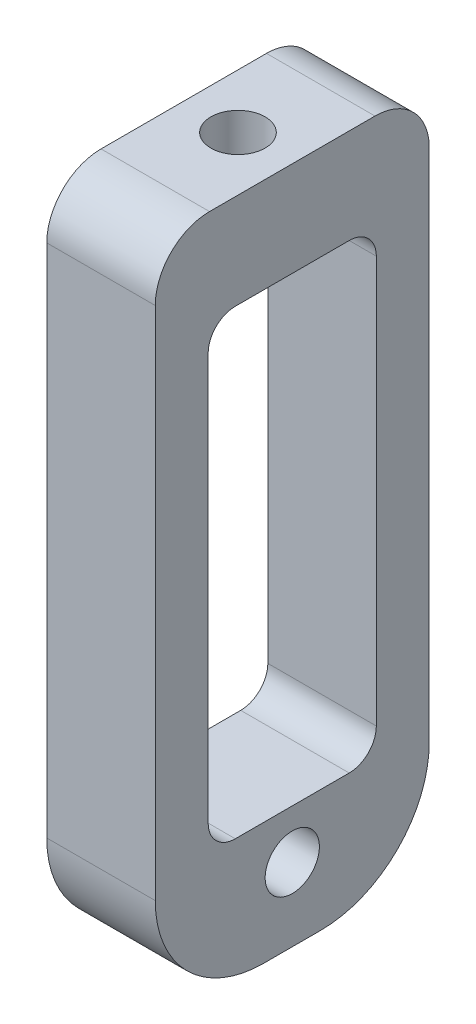
ISO-10303-21;
HEADER;
FILE_DESCRIPTION(('STEP AP214'),'2;1');
FILE_NAME('part.step','',(''),(''),'','','');
FILE_SCHEMA(('AUTOMOTIVE_DESIGN { 1 0 10303 214 1 1 1 1 }'));
ENDSEC;
DATA;
#1=APPLICATION_CONTEXT('core data for automotive mechanical design processes');
#2=APPLICATION_PROTOCOL_DEFINITION('international standard','automotive_design',2000,#1);
#3=PRODUCT_CONTEXT('',#1,'mechanical');
#4=PRODUCT('Part','Part','',(#3));
#5=PRODUCT_RELATED_PRODUCT_CATEGORY('part','',(#4));
#6=PRODUCT_DEFINITION_FORMATION('','',#4);
#7=PRODUCT_DEFINITION_CONTEXT('part definition',#1,'design');
#8=PRODUCT_DEFINITION('design','',#6,#7);
#9=PRODUCT_DEFINITION_SHAPE('','',#8);
#10=(LENGTH_UNIT() NAMED_UNIT(*) SI_UNIT(.MILLI.,.METRE.));
#11=(NAMED_UNIT(*) PLANE_ANGLE_UNIT() SI_UNIT($,.RADIAN.));
#12=(NAMED_UNIT(*) SI_UNIT($,.STERADIAN.) SOLID_ANGLE_UNIT());
#13=UNCERTAINTY_MEASURE_WITH_UNIT(LENGTH_MEASURE(1.E-05),#10,'distance_accuracy_value','');
#14=(GEOMETRIC_REPRESENTATION_CONTEXT(3) GLOBAL_UNCERTAINTY_ASSIGNED_CONTEXT((#13)) GLOBAL_UNIT_ASSIGNED_CONTEXT((#10,
#11,#12)) REPRESENTATION_CONTEXT('',''));
#15=CARTESIAN_POINT('',(0.,0.,0.));
#16=DIRECTION('',(0.,0.,1.));
#17=DIRECTION('',(1.,0.,0.));
#18=AXIS2_PLACEMENT_3D('',#15,#16,#17);
#19=CARTESIAN_POINT('',(2.,25.,5.05));
#20=DIRECTION('',(-1.,0.,0.));
#21=DIRECTION('',(0.,0.,1.));
#22=AXIS2_PLACEMENT_3D('',#19,#20,#21);
#23=PLANE('',#22);
#24=DIRECTION('',(0.,0.,-1.));
#25=VECTOR('',#24,1.);
#26=CARTESIAN_POINT('',(2.,4.5,3.1));
#27=LINE('',#26,#25);
#28=CARTESIAN_POINT('',(2.,4.5,2.1));
#29=VERTEX_POINT('',#28);
#30=CARTESIAN_POINT('',(2.,4.5,-2.1));
#31=VERTEX_POINT('',#30);
#32=EDGE_CURVE('E268',#29,#31,#27,.T.);
#33=ORIENTED_EDGE('',*,*,#32,.F.);
#34=CARTESIAN_POINT('',(2.,5.5,2.1));
#35=DIRECTION('',(-1.,0.,0.));
#36=DIRECTION('',(0.,0.,1.));
#37=AXIS2_PLACEMENT_3D('',#34,#35,#36);
#38=CIRCLE('',#37,1.);
#39=CARTESIAN_POINT('',(2.,5.5,3.1));
#40=VERTEX_POINT('',#39);
#41=EDGE_CURVE('E230',#29,#40,#38,.T.);
#42=ORIENTED_EDGE('',*,*,#41,.T.);
#43=DIRECTION('',(0.,-1.,0.));
#44=VECTOR('',#43,1.);
#45=CARTESIAN_POINT('',(2.,4.5,3.1));
#46=LINE('',#45,#44);
#47=CARTESIAN_POINT('',(2.,20.5,3.1));
#48=VERTEX_POINT('',#47);
#49=EDGE_CURVE('E259',#48,#40,#46,.T.);
#50=ORIENTED_EDGE('',*,*,#49,.F.);
#51=CARTESIAN_POINT('',(2.,20.5,2.1));
#52=DIRECTION('',(-1.,0.,0.));
#53=DIRECTION('',(0.,0.,1.));
#54=AXIS2_PLACEMENT_3D('',#51,#52,#53);
#55=CIRCLE('',#54,1.);
#56=CARTESIAN_POINT('',(2.,21.5,2.1));
#57=VERTEX_POINT('',#56);
#58=EDGE_CURVE('E11',#48,#57,#55,.T.);
#59=ORIENTED_EDGE('',*,*,#58,.T.);
#60=DIRECTION('',(0.,0.,1.));
#61=VECTOR('',#60,1.);
#62=CARTESIAN_POINT('',(2.,21.5,3.1));
#63=LINE('',#62,#61);
#64=CARTESIAN_POINT('',(2.,21.5,-2.1));
#65=VERTEX_POINT('',#64);
#66=EDGE_CURVE('E257',#65,#57,#63,.T.);
#67=ORIENTED_EDGE('',*,*,#66,.F.);
#68=CARTESIAN_POINT('',(2.,20.5,-2.1));
#69=DIRECTION('',(-1.,0.,0.));
#70=DIRECTION('',(0.,0.,1.));
#71=AXIS2_PLACEMENT_3D('',#68,#69,#70);
#72=CIRCLE('',#71,1.);
#73=CARTESIAN_POINT('',(2.,20.5,-3.1));
#74=VERTEX_POINT('',#73);
#75=EDGE_CURVE('E237',#65,#74,#72,.T.);
#76=ORIENTED_EDGE('',*,*,#75,.T.);
#77=DIRECTION('',(0.,1.,0.));
#78=VECTOR('',#77,1.);
#79=CARTESIAN_POINT('',(2.,4.5,-3.1));
#80=LINE('',#79,#78);
#81=CARTESIAN_POINT('',(2.,5.5,-3.1));
#82=VERTEX_POINT('',#81);
#83=EDGE_CURVE('E444',#82,#74,#80,.T.);
#84=ORIENTED_EDGE('',*,*,#83,.F.);
#85=CARTESIAN_POINT('',(2.,5.5,-2.1));
#86=DIRECTION('',(-1.,0.,0.));
#87=DIRECTION('',(0.,0.,1.));
#88=AXIS2_PLACEMENT_3D('',#85,#86,#87);
#89=CIRCLE('',#88,1.);
#90=EDGE_CURVE('E234',#82,#31,#89,.T.);
#91=ORIENTED_EDGE('',*,*,#90,.T.);
#92=EDGE_LOOP('',(#33,#42,#50,#59,#67,#76,#84,#91));
#93=FACE_BOUND('',#92,.T.);
#94=CARTESIAN_POINT('',(2.,2.7,0.));
#95=DIRECTION('',(-1.,0.,0.));
#96=DIRECTION('',(0.,0.,1.));
#97=AXIS2_PLACEMENT_3D('',#94,#95,#96);
#98=CIRCLE('',#97,1.);
#99=CARTESIAN_POINT('',(2.,2.7,1.));
#100=VERTEX_POINT('',#99);
#101=EDGE_CURVE('E266',#100,#100,#98,.F.);
#102=ORIENTED_EDGE('',*,*,#101,.F.);
#103=EDGE_LOOP('',(#102));
#104=FACE_BOUND('',#103,.T.);
#105=DIRECTION('',(0.,-1.,0.));
#106=VECTOR('',#105,1.);
#107=CARTESIAN_POINT('',(2.,25.,-5.05));
#108=LINE('',#107,#106);
#109=CARTESIAN_POINT('',(2.,23.,-5.05));
#110=VERTEX_POINT('',#109);
#111=CARTESIAN_POINT('',(2.,4.,-5.05));
#112=VERTEX_POINT('',#111);
#113=EDGE_CURVE('E175',#110,#112,#108,.T.);
#114=ORIENTED_EDGE('',*,*,#113,.F.);
#115=CARTESIAN_POINT('',(2.,23.,-3.05));
#116=DIRECTION('',(-1.,0.,0.));
#117=DIRECTION('',(0.,0.,1.));
#118=AXIS2_PLACEMENT_3D('',#115,#116,#117);
#119=CIRCLE('',#118,2.);
#120=CARTESIAN_POINT('',(2.,25.,-3.05));
#121=VERTEX_POINT('',#120);
#122=EDGE_CURVE('E205',#110,#121,#119,.F.);
#123=ORIENTED_EDGE('',*,*,#122,.T.);
#124=DIRECTION('',(0.,0.,-1.));
#125=VECTOR('',#124,1.);
#126=CARTESIAN_POINT('',(2.,25.,5.05));
#127=LINE('',#126,#125);
#128=CARTESIAN_POINT('',(2.,25.,3.05));
#129=VERTEX_POINT('',#128);
#130=EDGE_CURVE('E277',#129,#121,#127,.T.);
#131=ORIENTED_EDGE('',*,*,#130,.F.);
#132=CARTESIAN_POINT('',(2.,23.,3.05));
#133=DIRECTION('',(-1.,0.,0.));
#134=DIRECTION('',(0.,0.,1.));
#135=AXIS2_PLACEMENT_3D('',#132,#133,#134);
#136=CIRCLE('',#135,2.);
#137=CARTESIAN_POINT('',(2.,23.,5.05));
#138=VERTEX_POINT('',#137);
#139=EDGE_CURVE('E155',#129,#138,#136,.F.);
#140=ORIENTED_EDGE('',*,*,#139,.T.);
#141=DIRECTION('',(0.,-1.,0.));
#142=VECTOR('',#141,1.);
#143=CARTESIAN_POINT('',(2.,25.,5.05));
#144=LINE('',#143,#142);
#145=CARTESIAN_POINT('',(2.,4.,5.05));
#146=VERTEX_POINT('',#145);
#147=EDGE_CURVE('E148',#138,#146,#144,.T.);
#148=ORIENTED_EDGE('',*,*,#147,.T.);
#149=CARTESIAN_POINT('',(2.,4.,1.05));
#150=DIRECTION('',(-1.,0.,0.));
#151=DIRECTION('',(0.,0.,1.));
#152=AXIS2_PLACEMENT_3D('',#149,#150,#151);
#153=CIRCLE('',#152,4.);
#154=CARTESIAN_POINT('',(2.,0.,1.05));
#155=VERTEX_POINT('',#154);
#156=EDGE_CURVE('E152',#146,#155,#153,.F.);
#157=ORIENTED_EDGE('',*,*,#156,.T.);
#158=DIRECTION('',(0.,0.,-1.));
#159=VECTOR('',#158,1.);
#160=CARTESIAN_POINT('',(2.,0.,5.05));
#161=LINE('',#160,#159);
#162=CARTESIAN_POINT('',(2.,0.,-1.05));
#163=VERTEX_POINT('',#162);
#164=EDGE_CURVE('E276',#155,#163,#161,.T.);
#165=ORIENTED_EDGE('',*,*,#164,.T.);
#166=CARTESIAN_POINT('',(2.,4.,-1.05));
#167=DIRECTION('',(-1.,0.,0.));
#168=DIRECTION('',(0.,0.,1.));
#169=AXIS2_PLACEMENT_3D('',#166,#167,#168);
#170=CIRCLE('',#169,4.);
#171=EDGE_CURVE('E170',#163,#112,#170,.F.);
#172=ORIENTED_EDGE('',*,*,#171,.T.);
#173=EDGE_LOOP('',(#114,#123,#131,#140,#148,#157,#165,#172));
#174=FACE_BOUND('',#173,.T.);
#175=ADVANCED_FACE('F36',(#93,#104,#174),#23,.F.);
#176=CARTESIAN_POINT('',(-2.,25.,-5.05));
#177=DIRECTION('',(0.,0.,1.));
#178=DIRECTION('',(1.,0.,0.));
#179=AXIS2_PLACEMENT_3D('',#176,#177,#178);
#180=PLANE('',#179);
#181=DIRECTION('',(0.,-1.,0.));
#182=VECTOR('',#181,1.);
#183=CARTESIAN_POINT('',(-2.,25.,-5.05));
#184=LINE('',#183,#182);
#185=CARTESIAN_POINT('',(-2.,23.,-5.05));
#186=VERTEX_POINT('',#185);
#187=CARTESIAN_POINT('',(-2.,4.,-5.05));
#188=VERTEX_POINT('',#187);
#189=EDGE_CURVE('E179',#186,#188,#184,.T.);
#190=ORIENTED_EDGE('',*,*,#189,.F.);
#191=DIRECTION('',(-1.,0.,0.));
#192=VECTOR('',#191,1.);
#193=CARTESIAN_POINT('',(-2.,23.,-5.05));
#194=LINE('',#193,#192);
#195=EDGE_CURVE('E202',#186,#110,#194,.F.);
#196=ORIENTED_EDGE('',*,*,#195,.T.);
#197=ORIENTED_EDGE('',*,*,#113,.T.);
#198=DIRECTION('',(-1.,0.,0.));
#199=VECTOR('',#198,1.);
#200=CARTESIAN_POINT('',(-2.,4.,-5.05));
#201=LINE('',#200,#199);
#202=EDGE_CURVE('E189',#112,#188,#201,.T.);
#203=ORIENTED_EDGE('',*,*,#202,.T.);
#204=EDGE_LOOP('',(#190,#196,#197,#203));
#205=FACE_BOUND('',#204,.T.);
#206=ADVANCED_FACE('F298',(#205),#180,.F.);
#207=CARTESIAN_POINT('',(-2.,25.,5.05));
#208=DIRECTION('',(1.,0.,0.));
#209=DIRECTION('',(0.,0.,-1.));
#210=AXIS2_PLACEMENT_3D('',#207,#208,#209);
#211=PLANE('',#210);
#212=DIRECTION('',(0.,0.,-1.));
#213=VECTOR('',#212,1.);
#214=CARTESIAN_POINT('',(-2.,21.5,3.1));
#215=LINE('',#214,#213);
#216=CARTESIAN_POINT('',(-2.,21.5,2.1));
#217=VERTEX_POINT('',#216);
#218=CARTESIAN_POINT('',(-2.,21.5,-2.1));
#219=VERTEX_POINT('',#218);
#220=EDGE_CURVE('E243',#217,#219,#215,.T.);
#221=ORIENTED_EDGE('',*,*,#220,.F.);
#222=CARTESIAN_POINT('',(-2.,20.5,2.1));
#223=DIRECTION('',(1.,0.,0.));
#224=DIRECTION('',(0.,0.,-1.));
#225=AXIS2_PLACEMENT_3D('',#222,#223,#224);
#226=CIRCLE('',#225,1.);
#227=CARTESIAN_POINT('',(-2.,20.5,3.1));
#228=VERTEX_POINT('',#227);
#229=EDGE_CURVE('E44',#217,#228,#226,.T.);
#230=ORIENTED_EDGE('',*,*,#229,.T.);
#231=DIRECTION('',(0.,1.,0.));
#232=VECTOR('',#231,1.);
#233=CARTESIAN_POINT('',(-2.,4.5,3.1));
#234=LINE('',#233,#232);
#235=CARTESIAN_POINT('',(-2.,5.5,3.1));
#236=VERTEX_POINT('',#235);
#237=EDGE_CURVE('E242',#236,#228,#234,.T.);
#238=ORIENTED_EDGE('',*,*,#237,.F.);
#239=CARTESIAN_POINT('',(-2.,5.5,2.1));
#240=DIRECTION('',(1.,0.,0.));
#241=DIRECTION('',(0.,0.,-1.));
#242=AXIS2_PLACEMENT_3D('',#239,#240,#241);
#243=CIRCLE('',#242,1.);
#244=CARTESIAN_POINT('',(-2.,4.5,2.1));
#245=VERTEX_POINT('',#244);
#246=EDGE_CURVE('E228',#236,#245,#243,.T.);
#247=ORIENTED_EDGE('',*,*,#246,.T.);
#248=DIRECTION('',(0.,0.,1.));
#249=VECTOR('',#248,1.);
#250=CARTESIAN_POINT('',(-2.,4.5,3.1));
#251=LINE('',#250,#249);
#252=CARTESIAN_POINT('',(-2.,4.5,-2.1));
#253=VERTEX_POINT('',#252);
#254=EDGE_CURVE('E271',#253,#245,#251,.T.);
#255=ORIENTED_EDGE('',*,*,#254,.F.);
#256=CARTESIAN_POINT('',(-2.,5.5,-2.1));
#257=DIRECTION('',(1.,0.,0.));
#258=DIRECTION('',(0.,0.,-1.));
#259=AXIS2_PLACEMENT_3D('',#256,#257,#258);
#260=CIRCLE('',#259,1.);
#261=CARTESIAN_POINT('',(-2.,5.5,-3.1));
#262=VERTEX_POINT('',#261);
#263=EDGE_CURVE('E232',#253,#262,#260,.T.);
#264=ORIENTED_EDGE('',*,*,#263,.T.);
#265=DIRECTION('',(0.,-1.,0.));
#266=VECTOR('',#265,1.);
#267=CARTESIAN_POINT('',(-2.,4.5,-3.1));
#268=LINE('',#267,#266);
#269=CARTESIAN_POINT('',(-2.,20.5,-3.1));
#270=VERTEX_POINT('',#269);
#271=EDGE_CURVE('E452',#270,#262,#268,.T.);
#272=ORIENTED_EDGE('',*,*,#271,.F.);
#273=CARTESIAN_POINT('',(-2.,20.5,-2.1));
#274=DIRECTION('',(1.,0.,0.));
#275=DIRECTION('',(0.,0.,-1.));
#276=AXIS2_PLACEMENT_3D('',#273,#274,#275);
#277=CIRCLE('',#276,1.);
#278=EDGE_CURVE('E51',#270,#219,#277,.T.);
#279=ORIENTED_EDGE('',*,*,#278,.T.);
#280=EDGE_LOOP('',(#221,#230,#238,#247,#255,#264,#272,#279));
#281=FACE_BOUND('',#280,.T.);
#282=CARTESIAN_POINT('',(-2.,2.7,0.));
#283=DIRECTION('',(-1.,0.,0.));
#284=DIRECTION('',(0.,0.,1.));
#285=AXIS2_PLACEMENT_3D('',#282,#283,#284);
#286=CIRCLE('',#285,1.);
#287=CARTESIAN_POINT('',(-2.,2.7,1.));
#288=VERTEX_POINT('',#287);
#289=EDGE_CURVE('E263',#288,#288,#286,.T.);
#290=ORIENTED_EDGE('',*,*,#289,.F.);
#291=EDGE_LOOP('',(#290));
#292=FACE_BOUND('',#291,.T.);
#293=DIRECTION('',(0.,0.,1.));
#294=VECTOR('',#293,1.);
#295=CARTESIAN_POINT('',(-2.,25.,5.05));
#296=LINE('',#295,#294);
#297=CARTESIAN_POINT('',(-2.,25.,-3.05));
#298=VERTEX_POINT('',#297);
#299=CARTESIAN_POINT('',(-2.,25.,3.05));
#300=VERTEX_POINT('',#299);
#301=EDGE_CURVE('E160',#298,#300,#296,.T.);
#302=ORIENTED_EDGE('',*,*,#301,.F.);
#303=CARTESIAN_POINT('',(-2.,23.,-3.05));
#304=DIRECTION('',(1.,0.,0.));
#305=DIRECTION('',(0.,0.,-1.));
#306=AXIS2_PLACEMENT_3D('',#303,#304,#305);
#307=CIRCLE('',#306,2.);
#308=EDGE_CURVE('E200',#298,#186,#307,.F.);
#309=ORIENTED_EDGE('',*,*,#308,.T.);
#310=ORIENTED_EDGE('',*,*,#189,.T.);
#311=CARTESIAN_POINT('',(-2.,4.,-1.05));
#312=DIRECTION('',(1.,0.,0.));
#313=DIRECTION('',(0.,0.,-1.));
#314=AXIS2_PLACEMENT_3D('',#311,#312,#313);
#315=CIRCLE('',#314,4.);
#316=CARTESIAN_POINT('',(-2.,0.,-1.05));
#317=VERTEX_POINT('',#316);
#318=EDGE_CURVE('E185',#188,#317,#315,.F.);
#319=ORIENTED_EDGE('',*,*,#318,.T.);
#320=DIRECTION('',(0.,0.,1.));
#321=VECTOR('',#320,1.);
#322=CARTESIAN_POINT('',(-2.,0.,5.05));
#323=LINE('',#322,#321);
#324=CARTESIAN_POINT('',(-2.,0.,1.05));
#325=VERTEX_POINT('',#324);
#326=EDGE_CURVE('E280',#317,#325,#323,.T.);
#327=ORIENTED_EDGE('',*,*,#326,.T.);
#328=CARTESIAN_POINT('',(-2.,4.,1.05));
#329=DIRECTION('',(1.,0.,0.));
#330=DIRECTION('',(0.,0.,-1.));
#331=AXIS2_PLACEMENT_3D('',#328,#329,#330);
#332=CIRCLE('',#331,4.);
#333=CARTESIAN_POINT('',(-2.,4.,5.05));
#334=VERTEX_POINT('',#333);
#335=EDGE_CURVE('E187',#325,#334,#332,.F.);
#336=ORIENTED_EDGE('',*,*,#335,.T.);
#337=DIRECTION('',(0.,-1.,0.));
#338=VECTOR('',#337,1.);
#339=CARTESIAN_POINT('',(-2.,25.,5.05));
#340=LINE('',#339,#338);
#341=CARTESIAN_POINT('',(-2.,23.,5.05));
#342=VERTEX_POINT('',#341);
#343=EDGE_CURVE('E159',#342,#334,#340,.T.);
#344=ORIENTED_EDGE('',*,*,#343,.F.);
#345=CARTESIAN_POINT('',(-2.,23.,3.05));
#346=DIRECTION('',(1.,0.,0.));
#347=DIRECTION('',(0.,0.,-1.));
#348=AXIS2_PLACEMENT_3D('',#345,#346,#347);
#349=CIRCLE('',#348,2.);
#350=EDGE_CURVE('E198',#342,#300,#349,.F.);
#351=ORIENTED_EDGE('',*,*,#350,.T.);
#352=EDGE_LOOP('',(#302,#309,#310,#319,#327,#336,#344,#351));
#353=FACE_BOUND('',#352,.T.);
#354=ADVANCED_FACE('F240',(#281,#292,#353),#211,.F.);
#355=CARTESIAN_POINT('',(-2.,25.,5.05));
#356=DIRECTION('',(0.,0.,-1.));
#357=DIRECTION('',(-1.,0.,0.));
#358=AXIS2_PLACEMENT_3D('',#355,#356,#357);
#359=PLANE('',#358);
#360=ORIENTED_EDGE('',*,*,#147,.F.);
#361=DIRECTION('',(1.,0.,0.));
#362=VECTOR('',#361,1.);
#363=CARTESIAN_POINT('',(-2.,23.,5.05));
#364=LINE('',#363,#362);
#365=EDGE_CURVE('E207',#138,#342,#364,.F.);
#366=ORIENTED_EDGE('',*,*,#365,.T.);
#367=ORIENTED_EDGE('',*,*,#343,.T.);
#368=DIRECTION('',(1.,0.,0.));
#369=VECTOR('',#368,1.);
#370=CARTESIAN_POINT('',(2.,4.,5.05));
#371=LINE('',#370,#369);
#372=EDGE_CURVE('E167',#334,#146,#371,.T.);
#373=ORIENTED_EDGE('',*,*,#372,.T.);
#374=EDGE_LOOP('',(#360,#366,#367,#373));
#375=FACE_BOUND('',#374,.T.);
#376=ADVANCED_FACE('F172',(#375),#359,.F.);
#377=CARTESIAN_POINT('',(0.,25.,0.));
#378=DIRECTION('',(0.,-1.,0.));
#379=DIRECTION('',(0.,0.,-1.));
#380=AXIS2_PLACEMENT_3D('',#377,#378,#379);
#381=PLANE('',#380);
#382=CARTESIAN_POINT('',(0.,25.,0.));
#383=DIRECTION('',(0.,1.,0.));
#384=DIRECTION('',(0.,0.,1.));
#385=AXIS2_PLACEMENT_3D('',#382,#383,#384);
#386=CIRCLE('',#385,1.);
#387=CARTESIAN_POINT('',(0.,25.,1.));
#388=VERTEX_POINT('',#387);
#389=EDGE_CURVE('E460',#388,#388,#386,.T.);
#390=ORIENTED_EDGE('',*,*,#389,.F.);
#391=EDGE_LOOP('',(#390));
#392=FACE_BOUND('',#391,.T.);
#393=ORIENTED_EDGE('',*,*,#130,.T.);
#394=DIRECTION('',(-1.,0.,0.));
#395=VECTOR('',#394,1.);
#396=CARTESIAN_POINT('',(0.,25.,-3.05));
#397=LINE('',#396,#395);
#398=EDGE_CURVE('E195',#121,#298,#397,.T.);
#399=ORIENTED_EDGE('',*,*,#398,.T.);
#400=ORIENTED_EDGE('',*,*,#301,.T.);
#401=DIRECTION('',(1.,0.,0.));
#402=VECTOR('',#401,1.);
#403=CARTESIAN_POINT('',(0.,25.,3.05));
#404=LINE('',#403,#402);
#405=EDGE_CURVE('E192',#300,#129,#404,.T.);
#406=ORIENTED_EDGE('',*,*,#405,.T.);
#407=EDGE_LOOP('',(#393,#399,#400,#406));
#408=FACE_BOUND('',#407,.T.);
#409=ADVANCED_FACE('F307',(#392,#408),#381,.F.);
#410=CARTESIAN_POINT('',(0.,0.,0.));
#411=DIRECTION('',(0.,-1.,0.));
#412=DIRECTION('',(0.,0.,-1.));
#413=AXIS2_PLACEMENT_3D('',#410,#411,#412);
#414=PLANE('',#413);
#415=ORIENTED_EDGE('',*,*,#164,.F.);
#416=DIRECTION('',(1.,0.,0.));
#417=VECTOR('',#416,1.);
#418=CARTESIAN_POINT('',(-2.,0.,1.05));
#419=LINE('',#418,#417);
#420=EDGE_CURVE('E168',#155,#325,#419,.F.);
#421=ORIENTED_EDGE('',*,*,#420,.T.);
#422=ORIENTED_EDGE('',*,*,#326,.F.);
#423=DIRECTION('',(-1.,0.,0.));
#424=VECTOR('',#423,1.);
#425=CARTESIAN_POINT('',(2.,0.,-1.05));
#426=LINE('',#425,#424);
#427=EDGE_CURVE('E169',#317,#163,#426,.F.);
#428=ORIENTED_EDGE('',*,*,#427,.T.);
#429=EDGE_LOOP('',(#415,#421,#422,#428));
#430=FACE_BOUND('',#429,.T.);
#431=ADVANCED_FACE('F301',(#430),#414,.T.);
#432=CARTESIAN_POINT('',(4.82842712474619,2.7,0.));
#433=DIRECTION('',(-1.,0.,0.));
#434=DIRECTION('',(0.,0.,1.));
#435=AXIS2_PLACEMENT_3D('',#432,#433,#434);
#436=CYLINDRICAL_SURFACE('',#435,1.);
#437=ORIENTED_EDGE('',*,*,#101,.T.);
#438=EDGE_LOOP('',(#437));
#439=FACE_BOUND('',#438,.T.);
#440=ORIENTED_EDGE('',*,*,#289,.T.);
#441=EDGE_LOOP('',(#440));
#442=FACE_BOUND('',#441,.T.);
#443=ADVANCED_FACE('F353',(#439,#442),#436,.F.);
#444=CARTESIAN_POINT('',(20.095303258028,4.5,3.1));
#445=DIRECTION('',(0.,0.,1.));
#446=DIRECTION('',(0.,-1.,0.));
#447=AXIS2_PLACEMENT_3D('',#444,#445,#446);
#448=PLANE('',#447);
#449=ORIENTED_EDGE('',*,*,#49,.T.);
#450=DIRECTION('',(-1.,0.,0.));
#451=VECTOR('',#450,1.);
#452=CARTESIAN_POINT('',(-2.,5.5,3.1));
#453=LINE('',#452,#451);
#454=EDGE_CURVE('E211',#40,#236,#453,.T.);
#455=ORIENTED_EDGE('',*,*,#454,.T.);
#456=ORIENTED_EDGE('',*,*,#237,.T.);
#457=DIRECTION('',(-1.,0.,0.));
#458=VECTOR('',#457,1.);
#459=CARTESIAN_POINT('',(2.,20.5,3.1));
#460=LINE('',#459,#458);
#461=EDGE_CURVE('E209',#228,#48,#460,.F.);
#462=ORIENTED_EDGE('',*,*,#461,.T.);
#463=EDGE_LOOP('',(#449,#455,#456,#462));
#464=FACE_BOUND('',#463,.T.);
#465=ADVANCED_FACE('F246',(#464),#448,.F.);
#466=CARTESIAN_POINT('',(20.095303258028,4.5,3.1));
#467=DIRECTION('',(0.,-1.,0.));
#468=DIRECTION('',(0.,0.,-1.));
#469=AXIS2_PLACEMENT_3D('',#466,#467,#468);
#470=PLANE('',#469);
#471=ORIENTED_EDGE('',*,*,#254,.T.);
#472=DIRECTION('',(-1.,0.,0.));
#473=VECTOR('',#472,1.);
#474=CARTESIAN_POINT('',(2.,4.5,2.1));
#475=LINE('',#474,#473);
#476=EDGE_CURVE('E217',#245,#29,#475,.F.);
#477=ORIENTED_EDGE('',*,*,#476,.T.);
#478=ORIENTED_EDGE('',*,*,#32,.T.);
#479=DIRECTION('',(-1.,0.,0.));
#480=VECTOR('',#479,1.);
#481=CARTESIAN_POINT('',(-2.,4.5,-2.1));
#482=LINE('',#481,#480);
#483=EDGE_CURVE('E214',#31,#253,#482,.T.);
#484=ORIENTED_EDGE('',*,*,#483,.T.);
#485=EDGE_LOOP('',(#471,#477,#478,#484));
#486=FACE_BOUND('',#485,.T.);
#487=ADVANCED_FACE('F344',(#486),#470,.F.);
#488=CARTESIAN_POINT('',(20.095303258028,4.5,-3.1));
#489=DIRECTION('',(0.,0.,-1.));
#490=DIRECTION('',(0.,1.,0.));
#491=AXIS2_PLACEMENT_3D('',#488,#489,#490);
#492=PLANE('',#491);
#493=ORIENTED_EDGE('',*,*,#271,.T.);
#494=DIRECTION('',(-1.,0.,0.));
#495=VECTOR('',#494,1.);
#496=CARTESIAN_POINT('',(2.,5.5,-3.1));
#497=LINE('',#496,#495);
#498=EDGE_CURVE('E222',#262,#82,#497,.F.);
#499=ORIENTED_EDGE('',*,*,#498,.T.);
#500=ORIENTED_EDGE('',*,*,#83,.T.);
#501=DIRECTION('',(-1.,0.,0.));
#502=VECTOR('',#501,1.);
#503=CARTESIAN_POINT('',(-2.,20.5,-3.1));
#504=LINE('',#503,#502);
#505=EDGE_CURVE('E219',#74,#270,#504,.T.);
#506=ORIENTED_EDGE('',*,*,#505,.T.);
#507=EDGE_LOOP('',(#493,#499,#500,#506));
#508=FACE_BOUND('',#507,.T.);
#509=ADVANCED_FACE('F338',(#508),#492,.F.);
#510=CARTESIAN_POINT('',(20.095303258028,21.5,3.1));
#511=DIRECTION('',(0.,1.,0.));
#512=DIRECTION('',(0.,0.,1.));
#513=AXIS2_PLACEMENT_3D('',#510,#511,#512);
#514=PLANE('',#513);
#515=CARTESIAN_POINT('',(0.,21.5,0.));
#516=DIRECTION('',(0.,1.,0.));
#517=DIRECTION('',(0.,0.,1.));
#518=AXIS2_PLACEMENT_3D('',#515,#516,#517);
#519=CIRCLE('',#518,1.);
#520=CARTESIAN_POINT('',(0.,21.5,1.));
#521=VERTEX_POINT('',#520);
#522=EDGE_CURVE('E249',#521,#521,#519,.F.);
#523=ORIENTED_EDGE('',*,*,#522,.F.);
#524=EDGE_LOOP('',(#523));
#525=FACE_BOUND('',#524,.T.);
#526=ORIENTED_EDGE('',*,*,#220,.T.);
#527=DIRECTION('',(-1.,0.,0.));
#528=VECTOR('',#527,1.);
#529=CARTESIAN_POINT('',(2.,21.5,-2.1));
#530=LINE('',#529,#528);
#531=EDGE_CURVE('E226',#219,#65,#530,.F.);
#532=ORIENTED_EDGE('',*,*,#531,.T.);
#533=ORIENTED_EDGE('',*,*,#66,.T.);
#534=DIRECTION('',(-1.,0.,0.));
#535=VECTOR('',#534,1.);
#536=CARTESIAN_POINT('',(-2.,21.5,2.1));
#537=LINE('',#536,#535);
#538=EDGE_CURVE('E224',#57,#217,#537,.T.);
#539=ORIENTED_EDGE('',*,*,#538,.T.);
#540=EDGE_LOOP('',(#526,#532,#533,#539));
#541=FACE_BOUND('',#540,.T.);
#542=ADVANCED_FACE('F261',(#525,#541),#514,.F.);
#543=CARTESIAN_POINT('',(0.,18.6715728752538,0.));
#544=DIRECTION('',(0.,1.,0.));
#545=DIRECTION('',(0.,0.,1.));
#546=AXIS2_PLACEMENT_3D('',#543,#544,#545);
#547=CYLINDRICAL_SURFACE('',#546,1.);
#548=ORIENTED_EDGE('',*,*,#522,.T.);
#549=EDGE_LOOP('',(#548));
#550=FACE_BOUND('',#549,.T.);
#551=ORIENTED_EDGE('',*,*,#389,.T.);
#552=EDGE_LOOP('',(#551));
#553=FACE_BOUND('',#552,.T.);
#554=ADVANCED_FACE('F329',(#550,#553),#547,.F.);
#555=CARTESIAN_POINT('',(-2.,4.,1.05));
#556=DIRECTION('',(-1.,0.,0.));
#557=DIRECTION('',(0.,0.,1.));
#558=AXIS2_PLACEMENT_3D('',#555,#556,#557);
#559=CYLINDRICAL_SURFACE('',#558,4.);
#560=ORIENTED_EDGE('',*,*,#335,.F.);
#561=ORIENTED_EDGE('',*,*,#420,.F.);
#562=ORIENTED_EDGE('',*,*,#156,.F.);
#563=ORIENTED_EDGE('',*,*,#372,.F.);
#564=EDGE_LOOP('',(#560,#561,#562,#563));
#565=FACE_BOUND('',#564,.T.);
#566=ADVANCED_FACE('F166',(#565),#559,.T.);
#567=CARTESIAN_POINT('',(-2.,4.,-1.05));
#568=DIRECTION('',(1.,0.,0.));
#569=DIRECTION('',(0.,0.,-1.));
#570=AXIS2_PLACEMENT_3D('',#567,#568,#569);
#571=CYLINDRICAL_SURFACE('',#570,4.);
#572=ORIENTED_EDGE('',*,*,#171,.F.);
#573=ORIENTED_EDGE('',*,*,#427,.F.);
#574=ORIENTED_EDGE('',*,*,#318,.F.);
#575=ORIENTED_EDGE('',*,*,#202,.F.);
#576=EDGE_LOOP('',(#572,#573,#574,#575));
#577=FACE_BOUND('',#576,.T.);
#578=ADVANCED_FACE('F297',(#577),#571,.T.);
#579=CARTESIAN_POINT('',(0.,23.,-3.05));
#580=DIRECTION('',(-1.,0.,0.));
#581=DIRECTION('',(0.,0.,1.));
#582=AXIS2_PLACEMENT_3D('',#579,#580,#581);
#583=CYLINDRICAL_SURFACE('',#582,2.);
#584=ORIENTED_EDGE('',*,*,#122,.F.);
#585=ORIENTED_EDGE('',*,*,#195,.F.);
#586=ORIENTED_EDGE('',*,*,#308,.F.);
#587=ORIENTED_EDGE('',*,*,#398,.F.);
#588=EDGE_LOOP('',(#584,#585,#586,#587));
#589=FACE_BOUND('',#588,.T.);
#590=ADVANCED_FACE('F310',(#589),#583,.T.);
#591=CARTESIAN_POINT('',(0.,23.,3.05));
#592=DIRECTION('',(1.,0.,0.));
#593=DIRECTION('',(0.,0.,-1.));
#594=AXIS2_PLACEMENT_3D('',#591,#592,#593);
#595=CYLINDRICAL_SURFACE('',#594,2.);
#596=ORIENTED_EDGE('',*,*,#350,.F.);
#597=ORIENTED_EDGE('',*,*,#365,.F.);
#598=ORIENTED_EDGE('',*,*,#139,.F.);
#599=ORIENTED_EDGE('',*,*,#405,.F.);
#600=EDGE_LOOP('',(#596,#597,#598,#599));
#601=FACE_BOUND('',#600,.T.);
#602=ADVANCED_FACE('F305',(#601),#595,.T.);
#603=CARTESIAN_POINT('',(20.095303258028,5.5,2.1));
#604=DIRECTION('',(1.,0.,0.));
#605=DIRECTION('',(0.,0.,-1.));
#606=AXIS2_PLACEMENT_3D('',#603,#604,#605);
#607=CYLINDRICAL_SURFACE('',#606,1.);
#608=ORIENTED_EDGE('',*,*,#41,.F.);
#609=ORIENTED_EDGE('',*,*,#476,.F.);
#610=ORIENTED_EDGE('',*,*,#246,.F.);
#611=ORIENTED_EDGE('',*,*,#454,.F.);
#612=EDGE_LOOP('',(#608,#609,#610,#611));
#613=FACE_BOUND('',#612,.T.);
#614=ADVANCED_FACE('F317',(#613),#607,.F.);
#615=CARTESIAN_POINT('',(20.095303258028,5.5,-2.1));
#616=DIRECTION('',(1.,0.,0.));
#617=DIRECTION('',(0.,0.,-1.));
#618=AXIS2_PLACEMENT_3D('',#615,#616,#617);
#619=CYLINDRICAL_SURFACE('',#618,1.);
#620=ORIENTED_EDGE('',*,*,#90,.F.);
#621=ORIENTED_EDGE('',*,*,#498,.F.);
#622=ORIENTED_EDGE('',*,*,#263,.F.);
#623=ORIENTED_EDGE('',*,*,#483,.F.);
#624=EDGE_LOOP('',(#620,#621,#622,#623));
#625=FACE_BOUND('',#624,.T.);
#626=ADVANCED_FACE('F410',(#625),#619,.F.);
#627=CARTESIAN_POINT('',(20.095303258028,20.5,-2.1));
#628=DIRECTION('',(1.,0.,0.));
#629=DIRECTION('',(0.,0.,-1.));
#630=AXIS2_PLACEMENT_3D('',#627,#628,#629);
#631=CYLINDRICAL_SURFACE('',#630,1.);
#632=ORIENTED_EDGE('',*,*,#75,.F.);
#633=ORIENTED_EDGE('',*,*,#531,.F.);
#634=ORIENTED_EDGE('',*,*,#278,.F.);
#635=ORIENTED_EDGE('',*,*,#505,.F.);
#636=EDGE_LOOP('',(#632,#633,#634,#635));
#637=FACE_BOUND('',#636,.T.);
#638=ADVANCED_FACE('F421',(#637),#631,.F.);
#639=CARTESIAN_POINT('',(20.095303258028,20.5,2.1));
#640=DIRECTION('',(1.,0.,0.));
#641=DIRECTION('',(0.,0.,-1.));
#642=AXIS2_PLACEMENT_3D('',#639,#640,#641);
#643=CYLINDRICAL_SURFACE('',#642,1.);
#644=ORIENTED_EDGE('',*,*,#58,.F.);
#645=ORIENTED_EDGE('',*,*,#461,.F.);
#646=ORIENTED_EDGE('',*,*,#229,.F.);
#647=ORIENTED_EDGE('',*,*,#538,.F.);
#648=EDGE_LOOP('',(#644,#645,#646,#647));
#649=FACE_BOUND('',#648,.T.);
#650=ADVANCED_FACE('F38',(#649),#643,.F.);
#651=CLOSED_SHELL('',(#175,#206,#354,#376,#409,#431,#443,#465,#487,#509,#542,#554,#566,#578,
#590,#602,#614,#626,#638,#650));
#652=MANIFOLD_SOLID_BREP('B2',#651);
#653=ADVANCED_BREP_SHAPE_REPRESENTATION('',(#18,#652),#14);
#654=SHAPE_DEFINITION_REPRESENTATION(#9,#653);
ENDSEC;
END-ISO-10303-21;
